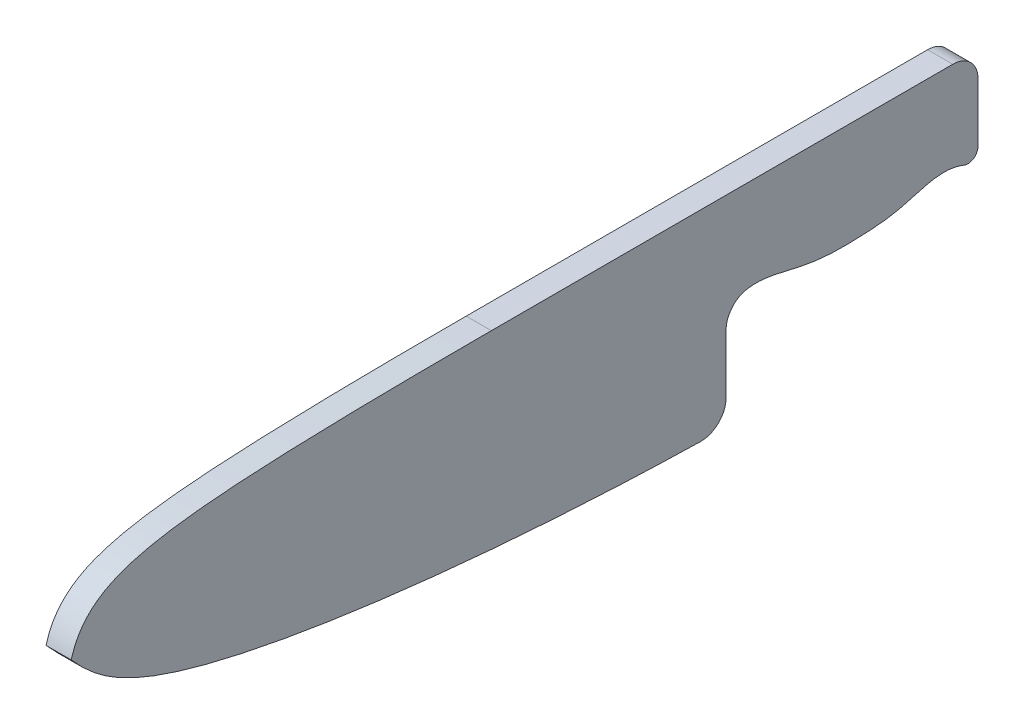
ISO-10303-21;
HEADER;
FILE_DESCRIPTION(('STEP AP214'),'2;1');
FILE_NAME('part.step','',(''),(''),'','','');
FILE_SCHEMA(('AUTOMOTIVE_DESIGN { 1 0 10303 214 1 1 1 1 }'));
ENDSEC;
DATA;
#1=APPLICATION_CONTEXT('core data for automotive mechanical design processes');
#2=APPLICATION_PROTOCOL_DEFINITION('international standard','automotive_design',2000,#1);
#3=PRODUCT_CONTEXT('',#1,'mechanical');
#4=PRODUCT('Part','Part','',(#3));
#5=PRODUCT_RELATED_PRODUCT_CATEGORY('part','',(#4));
#6=PRODUCT_DEFINITION_FORMATION('','',#4);
#7=PRODUCT_DEFINITION_CONTEXT('part definition',#1,'design');
#8=PRODUCT_DEFINITION('design','',#6,#7);
#9=PRODUCT_DEFINITION_SHAPE('','',#8);
#10=(LENGTH_UNIT() NAMED_UNIT(*) SI_UNIT(.MILLI.,.METRE.));
#11=(NAMED_UNIT(*) PLANE_ANGLE_UNIT() SI_UNIT($,.RADIAN.));
#12=(NAMED_UNIT(*) SI_UNIT($,.STERADIAN.) SOLID_ANGLE_UNIT());
#13=UNCERTAINTY_MEASURE_WITH_UNIT(LENGTH_MEASURE(1.E-05),#10,'distance_accuracy_value','');
#14=(GEOMETRIC_REPRESENTATION_CONTEXT(3) GLOBAL_UNCERTAINTY_ASSIGNED_CONTEXT((#13)) GLOBAL_UNIT_ASSIGNED_CONTEXT((#10,
#11,#12)) REPRESENTATION_CONTEXT('',''));
#15=CARTESIAN_POINT('',(0.,0.,0.));
#16=DIRECTION('',(0.,0.,1.));
#17=DIRECTION('',(1.,0.,0.));
#18=AXIS2_PLACEMENT_3D('',#15,#16,#17);
#19=CARTESIAN_POINT('',(5.,-14.9038464241338,0.));
#20=CARTESIAN_POINT('',(5.,-4.14849373019226,-2.95129566173372));
#21=CARTESIAN_POINT('',(5.,-1.88396672052469,-13.496276671583));
#22=CARTESIAN_POINT('',(5.,0.,-29.5290951403306));
#23=CARTESIAN_POINT('',(5.,0.,-83.4013338124167));
#24=B_SPLINE_CURVE_WITH_KNOTS('',4,(#19,#20,#21,#22,#23),.UNSPECIFIED.,.F.,.F.,(5,5),(0.,1.),.UNSPECIFIED.);
#25=DIRECTION('',(-1.,0.,0.));
#26=VECTOR('',#25,1.);
#27=SURFACE_OF_LINEAR_EXTRUSION('',#24,#26);
#28=CARTESIAN_POINT('',(0.,-14.9038464241338,0.));
#29=CARTESIAN_POINT('',(0.,-4.14849373019226,-2.95129566173372));
#30=CARTESIAN_POINT('',(0.,-1.88396672052469,-13.496276671583));
#31=CARTESIAN_POINT('',(0.,0.,-29.5290951403306));
#32=CARTESIAN_POINT('',(0.,0.,-83.4013338124167));
#33=B_SPLINE_CURVE_WITH_KNOTS('',4,(#28,#29,#30,#31,#32),.UNSPECIFIED.,.F.,.F.,(5,5),(0.,1.),.UNSPECIFIED.);
#34=CARTESIAN_POINT('',(0.,-14.9038464241338,0.));
#35=VERTEX_POINT('',#34);
#36=CARTESIAN_POINT('',(0.,0.,-83.4013338124167));
#37=VERTEX_POINT('',#36);
#38=EDGE_CURVE('E124',#35,#37,#33,.T.);
#39=ORIENTED_EDGE('',*,*,#38,.F.);
#40=DIRECTION('',(-1.,0.,0.));
#41=VECTOR('',#40,1.);
#42=CARTESIAN_POINT('',(5.,-14.9038464241338,0.));
#43=LINE('',#42,#41);
#44=CARTESIAN_POINT('',(5.,-14.9038464241338,0.));
#45=VERTEX_POINT('',#44);
#46=EDGE_CURVE('E119',#45,#35,#43,.T.);
#47=ORIENTED_EDGE('',*,*,#46,.F.);
#48=CARTESIAN_POINT('',(5.,0.,-83.4013338124167));
#49=VERTEX_POINT('',#48);
#50=EDGE_CURVE('E121',#45,#49,#24,.T.);
#51=ORIENTED_EDGE('',*,*,#50,.T.);
#52=DIRECTION('',(-1.,0.,0.));
#53=VECTOR('',#52,1.);
#54=CARTESIAN_POINT('',(5.,0.,-83.4013338124167));
#55=LINE('',#54,#53);
#56=EDGE_CURVE('E127',#49,#37,#55,.T.);
#57=ORIENTED_EDGE('',*,*,#56,.T.);
#58=EDGE_LOOP('',(#39,#47,#51,#57));
#59=FACE_BOUND('',#58,.T.);
#60=ADVANCED_FACE('F41',(#59),#27,.T.);
#61=CARTESIAN_POINT('',(5.,-14.9038464241338,0.));
#62=CARTESIAN_POINT('',(5.,-23.204673815793,-7.28949435430578));
#63=CARTESIAN_POINT('',(5.,-26.8311120683659,-14.3380644790249));
#64=CARTESIAN_POINT('',(5.,-33.2576794722144,-30.853925923509));
#65=CARTESIAN_POINT('',(5.,-40.,-80.7582344049425));
#66=CARTESIAN_POINT('',(5.,-40.,-139.759381928671));
#67=B_SPLINE_CURVE_WITH_KNOTS('',5,(#61,#62,#63,#64,#65,#66),.UNSPECIFIED.,.F.,.F.,(6,6),(0.,
1.),.UNSPECIFIED.);
#68=DIRECTION('',(-1.,0.,0.));
#69=VECTOR('',#68,1.);
#70=SURFACE_OF_LINEAR_EXTRUSION('',#67,#69);
#71=CARTESIAN_POINT('',(0.,-14.9038464241338,0.));
#72=CARTESIAN_POINT('',(0.,-23.204673815793,-7.28949435430578));
#73=CARTESIAN_POINT('',(0.,-26.8311120683659,-14.3380644790249));
#74=CARTESIAN_POINT('',(0.,-33.2576794722144,-30.853925923509));
#75=CARTESIAN_POINT('',(0.,-40.,-80.7582344049425));
#76=CARTESIAN_POINT('',(0.,-40.,-139.759381928671));
#77=B_SPLINE_CURVE_WITH_KNOTS('',5,(#71,#72,#73,#74,#75,#76),.UNSPECIFIED.,.F.,.F.,(6,6),(0.,
1.),.UNSPECIFIED.);
#78=CARTESIAN_POINT('',(0.,-39.8317425558253,-124.887720291468));
#79=VERTEX_POINT('',#78);
#80=EDGE_CURVE('E220',#35,#79,#77,.T.);
#81=ORIENTED_EDGE('',*,*,#80,.T.);
#82=DIRECTION('',(-1.,0.,0.));
#83=VECTOR('',#82,1.);
#84=CARTESIAN_POINT('',(0.,-39.8317425558253,-124.887720291468));
#85=LINE('',#84,#83);
#86=CARTESIAN_POINT('',(5.,-39.8317425558253,-124.887720291468));
#87=VERTEX_POINT('',#86);
#88=EDGE_CURVE('E11',#79,#87,#85,.F.);
#89=ORIENTED_EDGE('',*,*,#88,.T.);
#90=EDGE_CURVE('E129',#45,#87,#67,.T.);
#91=ORIENTED_EDGE('',*,*,#90,.F.);
#92=ORIENTED_EDGE('',*,*,#46,.T.);
#93=EDGE_LOOP('',(#81,#89,#91,#92));
#94=FACE_BOUND('',#93,.T.);
#95=ADVANCED_FACE('F130',(#94),#70,.F.);
#96=CARTESIAN_POINT('',(5.,0.,-130.));
#97=DIRECTION('',(0.,0.,-1.));
#98=DIRECTION('',(-1.,0.,0.));
#99=AXIS2_PLACEMENT_3D('',#96,#97,#98);
#100=PLANE('',#99);
#101=DIRECTION('',(0.,-1.,0.));
#102=VECTOR('',#101,1.);
#103=CARTESIAN_POINT('',(5.,0.,-130.));
#104=LINE('',#103,#102);
#105=CARTESIAN_POINT('',(5.,-23.1573171041104,-130.));
#106=VERTEX_POINT('',#105);
#107=CARTESIAN_POINT('',(5.,-34.8330033880899,-130.));
#108=VERTEX_POINT('',#107);
#109=EDGE_CURVE('E131',#106,#108,#104,.T.);
#110=ORIENTED_EDGE('',*,*,#109,.T.);
#111=DIRECTION('',(1.,0.,0.));
#112=VECTOR('',#111,1.);
#113=CARTESIAN_POINT('',(0.,-34.8330033880899,-130.));
#114=LINE('',#113,#112);
#115=CARTESIAN_POINT('',(0.,-34.8330033880899,-130.));
#116=VERTEX_POINT('',#115);
#117=EDGE_CURVE('E49',#108,#116,#114,.F.);
#118=ORIENTED_EDGE('',*,*,#117,.T.);
#119=DIRECTION('',(0.,-1.,0.));
#120=VECTOR('',#119,1.);
#121=CARTESIAN_POINT('',(0.,0.,-130.));
#122=LINE('',#121,#120);
#123=CARTESIAN_POINT('',(0.,-23.1573171041104,-130.));
#124=VERTEX_POINT('',#123);
#125=EDGE_CURVE('E214',#124,#116,#122,.T.);
#126=ORIENTED_EDGE('',*,*,#125,.F.);
#127=DIRECTION('',(-1.,0.,0.));
#128=VECTOR('',#127,1.);
#129=CARTESIAN_POINT('',(5.,-23.1573171041104,-130.));
#130=LINE('',#129,#128);
#131=EDGE_CURVE('E203',#124,#106,#130,.F.);
#132=ORIENTED_EDGE('',*,*,#131,.T.);
#133=EDGE_LOOP('',(#110,#118,#126,#132));
#134=FACE_BOUND('',#133,.T.);
#135=ADVANCED_FACE('F249',(#134),#100,.T.);
#136=CARTESIAN_POINT('',(5.,-20.,-130.));
#137=CARTESIAN_POINT('',(5.,-11.053747081909,-142.55496439757));
#138=CARTESIAN_POINT('',(5.,-34.9341755237242,-149.196912903773));
#139=CARTESIAN_POINT('',(5.,-5.37325526441555,-158.630756241077));
#140=CARTESIAN_POINT('',(5.,-33.9367404981705,-163.289648634566));
#141=CARTESIAN_POINT('',(5.,-10.14486839111,-166.072200521993));
#142=CARTESIAN_POINT('',(5.,-20.,-180.));
#143=B_SPLINE_CURVE_WITH_KNOTS('',6,(#136,#137,#138,#139,#140,#141,#142),.UNSPECIFIED.,.F.,.F.,
(7,7),(0.,1.),.UNSPECIFIED.);
#144=DIRECTION('',(-1.,0.,0.));
#145=VECTOR('',#144,1.);
#146=SURFACE_OF_LINEAR_EXTRUSION('',#143,#145);
#147=CARTESIAN_POINT('',(0.,-20.,-130.));
#148=CARTESIAN_POINT('',(0.,-11.053747081909,-142.55496439757));
#149=CARTESIAN_POINT('',(0.,-34.9341755237242,-149.196912903773));
#150=CARTESIAN_POINT('',(0.,-5.37325526441555,-158.630756241077));
#151=CARTESIAN_POINT('',(0.,-33.9367404981705,-163.289648634566));
#152=CARTESIAN_POINT('',(0.,-10.14486839111,-166.072200521993));
#153=CARTESIAN_POINT('',(0.,-20.,-180.));
#154=B_SPLINE_CURVE_WITH_KNOTS('',6,(#147,#148,#149,#150,#151,#152,#153),.UNSPECIFIED.,.F.,.F.,
(7,7),(0.,1.),.UNSPECIFIED.);
#155=CARTESIAN_POINT('',(0.,-18.2291901749905,-134.155272250673));
#156=VERTEX_POINT('',#155);
#157=CARTESIAN_POINT('',(0.,-18.4712177868793,-177.249282018589));
#158=VERTEX_POINT('',#157);
#159=EDGE_CURVE('E209',#156,#158,#154,.T.);
#160=ORIENTED_EDGE('',*,*,#159,.T.);
#161=DIRECTION('',(-1.,0.,0.));
#162=VECTOR('',#161,1.);
#163=CARTESIAN_POINT('',(0.,-18.4712177868793,-177.249282018589));
#164=LINE('',#163,#162);
#165=CARTESIAN_POINT('',(5.,-18.4712177868793,-177.249282018589));
#166=VERTEX_POINT('',#165);
#167=EDGE_CURVE('E192',#158,#166,#164,.F.);
#168=ORIENTED_EDGE('',*,*,#167,.T.);
#169=CARTESIAN_POINT('',(5.,-18.2291901749905,-134.155272250673));
#170=VERTEX_POINT('',#169);
#171=EDGE_CURVE('E236',#170,#166,#143,.T.);
#172=ORIENTED_EDGE('',*,*,#171,.F.);
#173=DIRECTION('',(-1.,0.,0.));
#174=VECTOR('',#173,1.);
#175=CARTESIAN_POINT('',(5.,-18.2291901749905,-134.155272250673));
#176=LINE('',#175,#174);
#177=EDGE_CURVE('E126',#170,#156,#176,.T.);
#178=ORIENTED_EDGE('',*,*,#177,.T.);
#179=EDGE_LOOP('',(#160,#168,#172,#178));
#180=FACE_BOUND('',#179,.T.);
#181=ADVANCED_FACE('F245',(#180),#146,.F.);
#182=CARTESIAN_POINT('',(5.,0.,-180.));
#183=DIRECTION('',(0.,0.,-1.));
#184=DIRECTION('',(-1.,0.,0.));
#185=AXIS2_PLACEMENT_3D('',#182,#183,#184);
#186=PLANE('',#185);
#187=DIRECTION('',(0.,-1.,0.));
#188=VECTOR('',#187,1.);
#189=CARTESIAN_POINT('',(0.,0.,-180.));
#190=LINE('',#189,#188);
#191=CARTESIAN_POINT('',(0.,-5.,-180.));
#192=VERTEX_POINT('',#191);
#193=CARTESIAN_POINT('',(0.,-16.6174587646798,-180.));
#194=VERTEX_POINT('',#193);
#195=EDGE_CURVE('E140',#192,#194,#190,.T.);
#196=ORIENTED_EDGE('',*,*,#195,.F.);
#197=DIRECTION('',(-1.,0.,0.));
#198=VECTOR('',#197,1.);
#199=CARTESIAN_POINT('',(5.,-5.,-180.));
#200=LINE('',#199,#198);
#201=CARTESIAN_POINT('',(5.,-5.,-180.));
#202=VERTEX_POINT('',#201);
#203=EDGE_CURVE('E176',#192,#202,#200,.F.);
#204=ORIENTED_EDGE('',*,*,#203,.T.);
#205=DIRECTION('',(0.,-1.,0.));
#206=VECTOR('',#205,1.);
#207=CARTESIAN_POINT('',(5.,0.,-180.));
#208=LINE('',#207,#206);
#209=CARTESIAN_POINT('',(5.,-16.6174587646798,-180.));
#210=VERTEX_POINT('',#209);
#211=EDGE_CURVE('E234',#202,#210,#208,.T.);
#212=ORIENTED_EDGE('',*,*,#211,.T.);
#213=DIRECTION('',(1.,0.,0.));
#214=VECTOR('',#213,1.);
#215=CARTESIAN_POINT('',(0.,-16.6174587646798,-180.));
#216=LINE('',#215,#214);
#217=EDGE_CURVE('E196',#210,#194,#216,.F.);
#218=ORIENTED_EDGE('',*,*,#217,.T.);
#219=EDGE_LOOP('',(#196,#204,#212,#218));
#220=FACE_BOUND('',#219,.T.);
#221=ADVANCED_FACE('F248',(#220),#186,.T.);
#222=CARTESIAN_POINT('',(5.,0.,0.));
#223=DIRECTION('',(0.,1.,0.));
#224=DIRECTION('',(0.,0.,1.));
#225=AXIS2_PLACEMENT_3D('',#222,#223,#224);
#226=PLANE('',#225);
#227=DIRECTION('',(0.,0.,-1.));
#228=VECTOR('',#227,1.);
#229=CARTESIAN_POINT('',(5.,0.,0.));
#230=LINE('',#229,#228);
#231=CARTESIAN_POINT('',(5.,0.,-175.));
#232=VERTEX_POINT('',#231);
#233=EDGE_CURVE('E136',#49,#232,#230,.T.);
#234=ORIENTED_EDGE('',*,*,#233,.T.);
#235=DIRECTION('',(-1.,0.,0.));
#236=VECTOR('',#235,1.);
#237=CARTESIAN_POINT('',(5.,0.,-175.));
#238=LINE('',#237,#236);
#239=CARTESIAN_POINT('',(0.,0.,-175.));
#240=VERTEX_POINT('',#239);
#241=EDGE_CURVE('E178',#232,#240,#238,.T.);
#242=ORIENTED_EDGE('',*,*,#241,.T.);
#243=DIRECTION('',(0.,0.,-1.));
#244=VECTOR('',#243,1.);
#245=CARTESIAN_POINT('',(0.,0.,0.));
#246=LINE('',#245,#244);
#247=EDGE_CURVE('E137',#37,#240,#246,.T.);
#248=ORIENTED_EDGE('',*,*,#247,.F.);
#249=ORIENTED_EDGE('',*,*,#56,.F.);
#250=EDGE_LOOP('',(#234,#242,#248,#249));
#251=FACE_BOUND('',#250,.T.);
#252=ADVANCED_FACE('F273',(#251),#226,.T.);
#253=CARTESIAN_POINT('',(5.,0.,0.));
#254=DIRECTION('',(1.,0.,0.));
#255=DIRECTION('',(0.,0.,-1.));
#256=AXIS2_PLACEMENT_3D('',#253,#254,#255);
#257=PLANE('',#256);
#258=ORIENTED_EDGE('',*,*,#211,.F.);
#259=CARTESIAN_POINT('',(5.,-5.,-175.));
#260=DIRECTION('',(1.,0.,0.));
#261=DIRECTION('',(0.,0.,-1.));
#262=AXIS2_PLACEMENT_3D('',#259,#260,#261);
#263=CIRCLE('',#262,5.);
#264=EDGE_CURVE('E175',#202,#232,#263,.T.);
#265=ORIENTED_EDGE('',*,*,#264,.T.);
#266=ORIENTED_EDGE('',*,*,#233,.F.);
#267=ORIENTED_EDGE('',*,*,#50,.F.);
#268=ORIENTED_EDGE('',*,*,#90,.T.);
#269=CARTESIAN_POINT('',(5.,-34.8330033880899,-125.));
#270=DIRECTION('',(1.,0.,0.));
#271=DIRECTION('',(0.,0.,-1.));
#272=AXIS2_PLACEMENT_3D('',#269,#270,#271);
#273=CIRCLE('',#272,5.);
#274=EDGE_CURVE('E56',#87,#108,#273,.T.);
#275=ORIENTED_EDGE('',*,*,#274,.T.);
#276=ORIENTED_EDGE('',*,*,#109,.F.);
#277=CARTESIAN_POINT('',(5.,-23.1573171041104,-135.));
#278=DIRECTION('',(1.,0.,0.));
#279=DIRECTION('',(0.,0.,-1.));
#280=AXIS2_PLACEMENT_3D('',#277,#278,#279);
#281=CIRCLE('',#280,5.);
#282=EDGE_CURVE('E199',#106,#170,#281,.F.);
#283=ORIENTED_EDGE('',*,*,#282,.T.);
#284=ORIENTED_EDGE('',*,*,#171,.T.);
#285=CARTESIAN_POINT('',(5.,-16.6174587646798,-178.));
#286=DIRECTION('',(1.,0.,0.));
#287=DIRECTION('',(0.,0.,-1.));
#288=AXIS2_PLACEMENT_3D('',#285,#286,#287);
#289=CIRCLE('',#288,2.);
#290=EDGE_CURVE('E189',#166,#210,#289,.T.);
#291=ORIENTED_EDGE('',*,*,#290,.T.);
#292=EDGE_LOOP('',(#258,#265,#266,#267,#268,#275,#276,#283,#284,#291));
#293=FACE_BOUND('',#292,.T.);
#294=ADVANCED_FACE('F134',(#293),#257,.T.);
#295=CARTESIAN_POINT('',(0.,0.,0.));
#296=DIRECTION('',(1.,0.,0.));
#297=DIRECTION('',(0.,0.,-1.));
#298=AXIS2_PLACEMENT_3D('',#295,#296,#297);
#299=PLANE('',#298);
#300=ORIENTED_EDGE('',*,*,#247,.T.);
#301=CARTESIAN_POINT('',(0.,-5.,-175.));
#302=DIRECTION('',(1.,0.,0.));
#303=DIRECTION('',(0.,0.,-1.));
#304=AXIS2_PLACEMENT_3D('',#301,#302,#303);
#305=CIRCLE('',#304,5.);
#306=EDGE_CURVE('E184',#240,#192,#305,.F.);
#307=ORIENTED_EDGE('',*,*,#306,.T.);
#308=ORIENTED_EDGE('',*,*,#195,.T.);
#309=CARTESIAN_POINT('',(0.,-16.6174587646798,-178.));
#310=DIRECTION('',(1.,0.,0.));
#311=DIRECTION('',(0.,0.,-1.));
#312=AXIS2_PLACEMENT_3D('',#309,#310,#311);
#313=CIRCLE('',#312,2.);
#314=EDGE_CURVE('E194',#194,#158,#313,.F.);
#315=ORIENTED_EDGE('',*,*,#314,.T.);
#316=ORIENTED_EDGE('',*,*,#159,.F.);
#317=CARTESIAN_POINT('',(0.,-23.1573171041104,-135.));
#318=DIRECTION('',(1.,0.,0.));
#319=DIRECTION('',(0.,0.,-1.));
#320=AXIS2_PLACEMENT_3D('',#317,#318,#319);
#321=CIRCLE('',#320,5.);
#322=EDGE_CURVE('E201',#156,#124,#321,.T.);
#323=ORIENTED_EDGE('',*,*,#322,.T.);
#324=ORIENTED_EDGE('',*,*,#125,.T.);
#325=CARTESIAN_POINT('',(0.,-34.8330033880899,-125.));
#326=DIRECTION('',(1.,0.,0.));
#327=DIRECTION('',(0.,0.,-1.));
#328=AXIS2_PLACEMENT_3D('',#325,#326,#327);
#329=CIRCLE('',#328,5.);
#330=EDGE_CURVE('E186',#116,#79,#329,.F.);
#331=ORIENTED_EDGE('',*,*,#330,.T.);
#332=ORIENTED_EDGE('',*,*,#80,.F.);
#333=ORIENTED_EDGE('',*,*,#38,.T.);
#334=EDGE_LOOP('',(#300,#307,#308,#315,#316,#323,#324,#331,#332,#333));
#335=FACE_BOUND('',#334,.T.);
#336=ADVANCED_FACE('F161',(#335),#299,.F.);
#337=CARTESIAN_POINT('',(2.5,-23.1573171041104,-135.));
#338=DIRECTION('',(-1.,0.,0.));
#339=DIRECTION('',(0.,0.,1.));
#340=AXIS2_PLACEMENT_3D('',#337,#338,#339);
#341=CYLINDRICAL_SURFACE('',#340,5.);
#342=ORIENTED_EDGE('',*,*,#282,.F.);
#343=ORIENTED_EDGE('',*,*,#131,.F.);
#344=ORIENTED_EDGE('',*,*,#322,.F.);
#345=ORIENTED_EDGE('',*,*,#177,.F.);
#346=EDGE_LOOP('',(#342,#343,#344,#345));
#347=FACE_BOUND('',#346,.T.);
#348=ADVANCED_FACE('F157',(#347),#341,.F.);
#349=CARTESIAN_POINT('',(2.5,-16.6174587646798,-178.));
#350=DIRECTION('',(-1.,0.,0.));
#351=DIRECTION('',(0.,0.,1.));
#352=AXIS2_PLACEMENT_3D('',#349,#350,#351);
#353=CYLINDRICAL_SURFACE('',#352,2.);
#354=ORIENTED_EDGE('',*,*,#290,.F.);
#355=ORIENTED_EDGE('',*,*,#167,.F.);
#356=ORIENTED_EDGE('',*,*,#314,.F.);
#357=ORIENTED_EDGE('',*,*,#217,.F.);
#358=EDGE_LOOP('',(#354,#355,#356,#357));
#359=FACE_BOUND('',#358,.T.);
#360=ADVANCED_FACE('F160',(#359),#353,.T.);
#361=CARTESIAN_POINT('',(5.,-5.,-175.));
#362=DIRECTION('',(-1.,0.,0.));
#363=DIRECTION('',(0.,0.,1.));
#364=AXIS2_PLACEMENT_3D('',#361,#362,#363);
#365=CYLINDRICAL_SURFACE('',#364,5.);
#366=ORIENTED_EDGE('',*,*,#264,.F.);
#367=ORIENTED_EDGE('',*,*,#203,.F.);
#368=ORIENTED_EDGE('',*,*,#306,.F.);
#369=ORIENTED_EDGE('',*,*,#241,.F.);
#370=EDGE_LOOP('',(#366,#367,#368,#369));
#371=FACE_BOUND('',#370,.T.);
#372=ADVANCED_FACE('F164',(#371),#365,.T.);
#373=CARTESIAN_POINT('',(2.5,-34.8330033880899,-125.));
#374=DIRECTION('',(-1.,0.,0.));
#375=DIRECTION('',(0.,0.,1.));
#376=AXIS2_PLACEMENT_3D('',#373,#374,#375);
#377=CYLINDRICAL_SURFACE('',#376,5.);
#378=ORIENTED_EDGE('',*,*,#274,.F.);
#379=ORIENTED_EDGE('',*,*,#88,.F.);
#380=ORIENTED_EDGE('',*,*,#330,.F.);
#381=ORIENTED_EDGE('',*,*,#117,.F.);
#382=EDGE_LOOP('',(#378,#379,#380,#381));
#383=FACE_BOUND('',#382,.T.);
#384=ADVANCED_FACE('F43',(#383),#377,.T.);
#385=CLOSED_SHELL('',(#60,#95,#135,#181,#221,#252,#294,#336,#348,#360,#372,#384));
#386=MANIFOLD_SOLID_BREP('B2',#385);
#387=ADVANCED_BREP_SHAPE_REPRESENTATION('',(#18,#386),#14);
#388=SHAPE_DEFINITION_REPRESENTATION(#9,#387);
ENDSEC;
END-ISO-10303-21;
